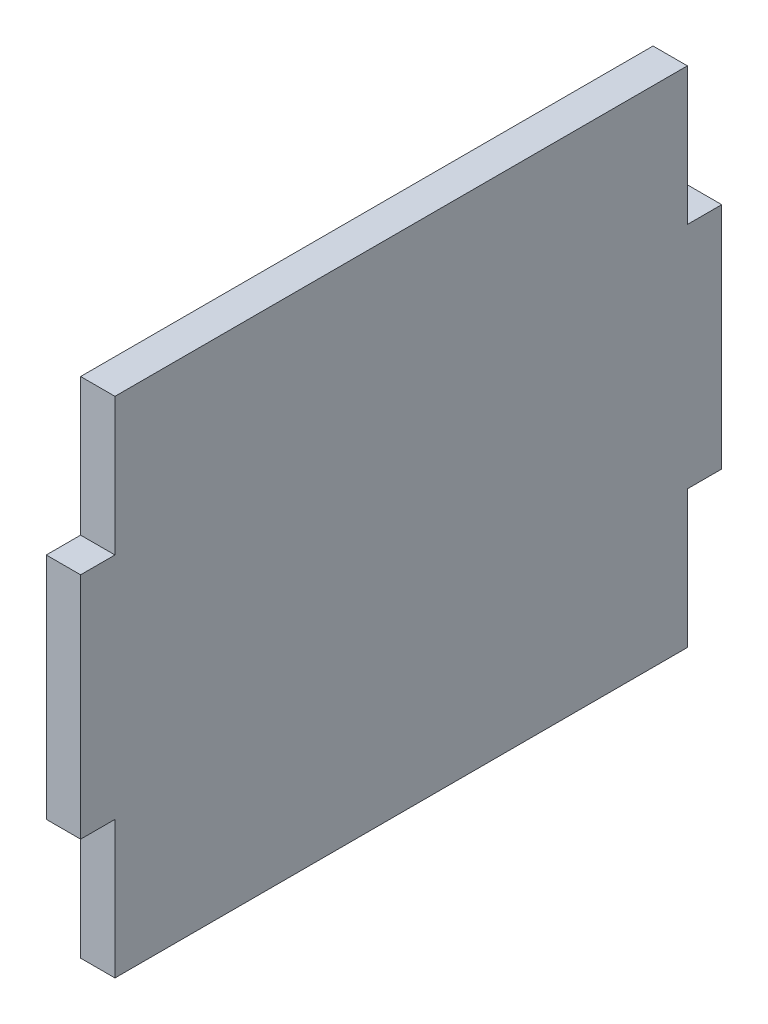
ISO-10303-21;
HEADER;
FILE_DESCRIPTION(('STEP AP214'),'2;1');
FILE_NAME('part.step','',(''),(''),'','','');
FILE_SCHEMA(('AUTOMOTIVE_DESIGN { 1 0 10303 214 1 1 1 1 }'));
ENDSEC;
DATA;
#1=APPLICATION_CONTEXT('core data for automotive mechanical design processes');
#2=APPLICATION_PROTOCOL_DEFINITION('international standard','automotive_design',2000,#1);
#3=PRODUCT_CONTEXT('',#1,'mechanical');
#4=PRODUCT('Part','Part','',(#3));
#5=PRODUCT_RELATED_PRODUCT_CATEGORY('part','',(#4));
#6=PRODUCT_DEFINITION_FORMATION('','',#4);
#7=PRODUCT_DEFINITION_CONTEXT('part definition',#1,'design');
#8=PRODUCT_DEFINITION('design','',#6,#7);
#9=PRODUCT_DEFINITION_SHAPE('','',#8);
#10=(LENGTH_UNIT() NAMED_UNIT(*) SI_UNIT(.MILLI.,.METRE.));
#11=(NAMED_UNIT(*) PLANE_ANGLE_UNIT() SI_UNIT($,.RADIAN.));
#12=(NAMED_UNIT(*) SI_UNIT($,.STERADIAN.) SOLID_ANGLE_UNIT());
#13=UNCERTAINTY_MEASURE_WITH_UNIT(LENGTH_MEASURE(1.E-05),#10,'distance_accuracy_value','');
#14=(GEOMETRIC_REPRESENTATION_CONTEXT(3) GLOBAL_UNCERTAINTY_ASSIGNED_CONTEXT((#13)) GLOBAL_UNIT_ASSIGNED_CONTEXT((#10,
#11,#12)) REPRESENTATION_CONTEXT('',''));
#15=CARTESIAN_POINT('',(0.,0.,0.));
#16=DIRECTION('',(0.,0.,1.));
#17=DIRECTION('',(1.,0.,0.));
#18=AXIS2_PLACEMENT_3D('',#15,#16,#17);
#19=CARTESIAN_POINT('',(3.,0.,0.));
#20=DIRECTION('',(0.,0.,-1.));
#21=DIRECTION('',(-1.,0.,0.));
#22=AXIS2_PLACEMENT_3D('',#19,#20,#21);
#23=PLANE('',#22);
#24=DIRECTION('',(0.,-1.,0.));
#25=VECTOR('',#24,1.);
#26=CARTESIAN_POINT('',(0.,0.,0.));
#27=LINE('',#26,#25);
#28=CARTESIAN_POINT('',(0.,12.,0.));
#29=VERTEX_POINT('',#28);
#30=CARTESIAN_POINT('',(0.,0.,0.));
#31=VERTEX_POINT('',#30);
#32=EDGE_CURVE('E159',#29,#31,#27,.T.);
#33=ORIENTED_EDGE('',*,*,#32,.T.);
#34=DIRECTION('',(-1.,0.,0.));
#35=VECTOR('',#34,1.);
#36=CARTESIAN_POINT('',(3.,0.,0.));
#37=LINE('',#36,#35);
#38=CARTESIAN_POINT('',(3.,0.,0.));
#39=VERTEX_POINT('',#38);
#40=EDGE_CURVE('E11',#39,#31,#37,.T.);
#41=ORIENTED_EDGE('',*,*,#40,.F.);
#42=DIRECTION('',(0.,-1.,0.));
#43=VECTOR('',#42,1.);
#44=CARTESIAN_POINT('',(3.,0.,0.));
#45=LINE('',#44,#43);
#46=CARTESIAN_POINT('',(3.,12.,0.));
#47=VERTEX_POINT('',#46);
#48=EDGE_CURVE('E181',#47,#39,#45,.T.);
#49=ORIENTED_EDGE('',*,*,#48,.F.);
#50=DIRECTION('',(-1.,0.,0.));
#51=VECTOR('',#50,1.);
#52=CARTESIAN_POINT('',(3.,12.,0.));
#53=LINE('',#52,#51);
#54=EDGE_CURVE('E155',#47,#29,#53,.T.);
#55=ORIENTED_EDGE('',*,*,#54,.T.);
#56=EDGE_LOOP('',(#33,#41,#49,#55));
#57=FACE_BOUND('',#56,.T.);
#58=ADVANCED_FACE('F39',(#57),#23,.F.);
#59=CARTESIAN_POINT('',(3.,0.,0.));
#60=DIRECTION('',(0.,1.,0.));
#61=DIRECTION('',(0.,0.,1.));
#62=AXIS2_PLACEMENT_3D('',#59,#60,#61);
#63=PLANE('',#62);
#64=DIRECTION('',(0.,0.,-1.));
#65=VECTOR('',#64,1.);
#66=CARTESIAN_POINT('',(0.,0.,0.));
#67=LINE('',#66,#65);
#68=CARTESIAN_POINT('',(0.,0.,-50.));
#69=VERTEX_POINT('',#68);
#70=EDGE_CURVE('E162',#31,#69,#67,.T.);
#71=ORIENTED_EDGE('',*,*,#70,.T.);
#72=DIRECTION('',(-1.,0.,0.));
#73=VECTOR('',#72,1.);
#74=CARTESIAN_POINT('',(3.,0.,-50.));
#75=LINE('',#74,#73);
#76=CARTESIAN_POINT('',(3.,0.,-50.));
#77=VERTEX_POINT('',#76);
#78=EDGE_CURVE('E47',#77,#69,#75,.T.);
#79=ORIENTED_EDGE('',*,*,#78,.F.);
#80=DIRECTION('',(0.,0.,-1.));
#81=VECTOR('',#80,1.);
#82=CARTESIAN_POINT('',(3.,0.,0.));
#83=LINE('',#82,#81);
#84=EDGE_CURVE('E110',#39,#77,#83,.T.);
#85=ORIENTED_EDGE('',*,*,#84,.F.);
#86=ORIENTED_EDGE('',*,*,#40,.T.);
#87=EDGE_LOOP('',(#71,#79,#85,#86));
#88=FACE_BOUND('',#87,.T.);
#89=ADVANCED_FACE('F259',(#88),#63,.F.);
#90=CARTESIAN_POINT('',(3.,0.,-50.));
#91=DIRECTION('',(0.,0.,1.));
#92=DIRECTION('',(1.,0.,0.));
#93=AXIS2_PLACEMENT_3D('',#90,#91,#92);
#94=PLANE('',#93);
#95=DIRECTION('',(0.,1.,0.));
#96=VECTOR('',#95,1.);
#97=CARTESIAN_POINT('',(0.,0.,-50.));
#98=LINE('',#97,#96);
#99=CARTESIAN_POINT('',(0.,12.,-50.));
#100=VERTEX_POINT('',#99);
#101=EDGE_CURVE('E164',#69,#100,#98,.T.);
#102=ORIENTED_EDGE('',*,*,#101,.T.);
#103=DIRECTION('',(-1.,0.,0.));
#104=VECTOR('',#103,1.);
#105=CARTESIAN_POINT('',(3.,12.,-50.));
#106=LINE('',#105,#104);
#107=CARTESIAN_POINT('',(3.,12.,-50.));
#108=VERTEX_POINT('',#107);
#109=EDGE_CURVE('E200',#108,#100,#106,.T.);
#110=ORIENTED_EDGE('',*,*,#109,.F.);
#111=DIRECTION('',(0.,1.,0.));
#112=VECTOR('',#111,1.);
#113=CARTESIAN_POINT('',(3.,0.,-50.));
#114=LINE('',#113,#112);
#115=EDGE_CURVE('E208',#77,#108,#114,.T.);
#116=ORIENTED_EDGE('',*,*,#115,.F.);
#117=ORIENTED_EDGE('',*,*,#78,.T.);
#118=EDGE_LOOP('',(#102,#110,#116,#117));
#119=FACE_BOUND('',#118,.T.);
#120=ADVANCED_FACE('F206',(#119),#94,.F.);
#121=CARTESIAN_POINT('',(3.,12.,-53.));
#122=DIRECTION('',(0.,1.,0.));
#123=DIRECTION('',(0.,0.,1.));
#124=AXIS2_PLACEMENT_3D('',#121,#122,#123);
#125=PLANE('',#124);
#126=DIRECTION('',(0.,0.,-1.));
#127=VECTOR('',#126,1.);
#128=CARTESIAN_POINT('',(0.,12.,-53.));
#129=LINE('',#128,#127);
#130=CARTESIAN_POINT('',(0.,12.,-53.));
#131=VERTEX_POINT('',#130);
#132=EDGE_CURVE('E166',#100,#131,#129,.T.);
#133=ORIENTED_EDGE('',*,*,#132,.T.);
#134=DIRECTION('',(-1.,0.,0.));
#135=VECTOR('',#134,1.);
#136=CARTESIAN_POINT('',(3.,12.,-53.));
#137=LINE('',#136,#135);
#138=CARTESIAN_POINT('',(3.,12.,-53.));
#139=VERTEX_POINT('',#138);
#140=EDGE_CURVE('E197',#139,#131,#137,.T.);
#141=ORIENTED_EDGE('',*,*,#140,.F.);
#142=DIRECTION('',(0.,0.,-1.));
#143=VECTOR('',#142,1.);
#144=CARTESIAN_POINT('',(3.,12.,-53.));
#145=LINE('',#144,#143);
#146=EDGE_CURVE('E226',#108,#139,#145,.T.);
#147=ORIENTED_EDGE('',*,*,#146,.F.);
#148=ORIENTED_EDGE('',*,*,#109,.T.);
#149=EDGE_LOOP('',(#133,#141,#147,#148));
#150=FACE_BOUND('',#149,.T.);
#151=ADVANCED_FACE('F217',(#150),#125,.F.);
#152=CARTESIAN_POINT('',(3.,12.,-53.));
#153=DIRECTION('',(0.,0.,1.));
#154=DIRECTION('',(1.,0.,0.));
#155=AXIS2_PLACEMENT_3D('',#152,#153,#154);
#156=PLANE('',#155);
#157=DIRECTION('',(0.,1.,0.));
#158=VECTOR('',#157,1.);
#159=CARTESIAN_POINT('',(0.,12.,-53.));
#160=LINE('',#159,#158);
#161=CARTESIAN_POINT('',(0.,32.,-53.));
#162=VERTEX_POINT('',#161);
#163=EDGE_CURVE('E168',#131,#162,#160,.T.);
#164=ORIENTED_EDGE('',*,*,#163,.T.);
#165=DIRECTION('',(-1.,0.,0.));
#166=VECTOR('',#165,1.);
#167=CARTESIAN_POINT('',(3.,32.,-53.));
#168=LINE('',#167,#166);
#169=CARTESIAN_POINT('',(3.,32.,-53.));
#170=VERTEX_POINT('',#169);
#171=EDGE_CURVE('E194',#170,#162,#168,.T.);
#172=ORIENTED_EDGE('',*,*,#171,.F.);
#173=DIRECTION('',(0.,1.,0.));
#174=VECTOR('',#173,1.);
#175=CARTESIAN_POINT('',(3.,12.,-53.));
#176=LINE('',#175,#174);
#177=EDGE_CURVE('E223',#139,#170,#176,.T.);
#178=ORIENTED_EDGE('',*,*,#177,.F.);
#179=ORIENTED_EDGE('',*,*,#140,.T.);
#180=EDGE_LOOP('',(#164,#172,#178,#179));
#181=FACE_BOUND('',#180,.T.);
#182=ADVANCED_FACE('F221',(#181),#156,.F.);
#183=CARTESIAN_POINT('',(3.,32.,-53.));
#184=DIRECTION('',(0.,-1.,0.));
#185=DIRECTION('',(0.,0.,-1.));
#186=AXIS2_PLACEMENT_3D('',#183,#184,#185);
#187=PLANE('',#186);
#188=DIRECTION('',(0.,0.,1.));
#189=VECTOR('',#188,1.);
#190=CARTESIAN_POINT('',(0.,32.,-53.));
#191=LINE('',#190,#189);
#192=CARTESIAN_POINT('',(0.,32.,-50.));
#193=VERTEX_POINT('',#192);
#194=EDGE_CURVE('E170',#162,#193,#191,.T.);
#195=ORIENTED_EDGE('',*,*,#194,.T.);
#196=DIRECTION('',(-1.,0.,0.));
#197=VECTOR('',#196,1.);
#198=CARTESIAN_POINT('',(3.,32.,-50.));
#199=LINE('',#198,#197);
#200=CARTESIAN_POINT('',(3.,32.,-50.));
#201=VERTEX_POINT('',#200);
#202=EDGE_CURVE('E191',#201,#193,#199,.T.);
#203=ORIENTED_EDGE('',*,*,#202,.F.);
#204=DIRECTION('',(0.,0.,1.));
#205=VECTOR('',#204,1.);
#206=CARTESIAN_POINT('',(3.,32.,-53.));
#207=LINE('',#206,#205);
#208=EDGE_CURVE('E225',#170,#201,#207,.T.);
#209=ORIENTED_EDGE('',*,*,#208,.F.);
#210=ORIENTED_EDGE('',*,*,#171,.T.);
#211=EDGE_LOOP('',(#195,#203,#209,#210));
#212=FACE_BOUND('',#211,.T.);
#213=ADVANCED_FACE('F272',(#212),#187,.F.);
#214=CARTESIAN_POINT('',(3.,32.,-50.));
#215=DIRECTION('',(0.,0.,1.));
#216=DIRECTION('',(1.,0.,0.));
#217=AXIS2_PLACEMENT_3D('',#214,#215,#216);
#218=PLANE('',#217);
#219=DIRECTION('',(0.,1.,0.));
#220=VECTOR('',#219,1.);
#221=CARTESIAN_POINT('',(0.,32.,-50.));
#222=LINE('',#221,#220);
#223=CARTESIAN_POINT('',(0.,44.,-50.));
#224=VERTEX_POINT('',#223);
#225=EDGE_CURVE('E172',#193,#224,#222,.T.);
#226=ORIENTED_EDGE('',*,*,#225,.T.);
#227=DIRECTION('',(-1.,0.,0.));
#228=VECTOR('',#227,1.);
#229=CARTESIAN_POINT('',(3.,44.,-50.));
#230=LINE('',#229,#228);
#231=CARTESIAN_POINT('',(3.,44.,-50.));
#232=VERTEX_POINT('',#231);
#233=EDGE_CURVE('E188',#232,#224,#230,.T.);
#234=ORIENTED_EDGE('',*,*,#233,.F.);
#235=DIRECTION('',(0.,1.,0.));
#236=VECTOR('',#235,1.);
#237=CARTESIAN_POINT('',(3.,32.,-50.));
#238=LINE('',#237,#236);
#239=EDGE_CURVE('E228',#201,#232,#238,.T.);
#240=ORIENTED_EDGE('',*,*,#239,.F.);
#241=ORIENTED_EDGE('',*,*,#202,.T.);
#242=EDGE_LOOP('',(#226,#234,#240,#241));
#243=FACE_BOUND('',#242,.T.);
#244=ADVANCED_FACE('F275',(#243),#218,.F.);
#245=CARTESIAN_POINT('',(3.,44.,0.));
#246=DIRECTION('',(0.,-1.,0.));
#247=DIRECTION('',(0.,0.,-1.));
#248=AXIS2_PLACEMENT_3D('',#245,#246,#247);
#249=PLANE('',#248);
#250=DIRECTION('',(0.,0.,1.));
#251=VECTOR('',#250,1.);
#252=CARTESIAN_POINT('',(0.,44.,0.));
#253=LINE('',#252,#251);
#254=CARTESIAN_POINT('',(0.,44.,0.));
#255=VERTEX_POINT('',#254);
#256=EDGE_CURVE('E174',#224,#255,#253,.T.);
#257=ORIENTED_EDGE('',*,*,#256,.T.);
#258=DIRECTION('',(-1.,0.,0.));
#259=VECTOR('',#258,1.);
#260=CARTESIAN_POINT('',(3.,44.,0.));
#261=LINE('',#260,#259);
#262=CARTESIAN_POINT('',(3.,44.,0.));
#263=VERTEX_POINT('',#262);
#264=EDGE_CURVE('E185',#263,#255,#261,.T.);
#265=ORIENTED_EDGE('',*,*,#264,.F.);
#266=DIRECTION('',(0.,0.,1.));
#267=VECTOR('',#266,1.);
#268=CARTESIAN_POINT('',(3.,44.,0.));
#269=LINE('',#268,#267);
#270=EDGE_CURVE('E234',#232,#263,#269,.T.);
#271=ORIENTED_EDGE('',*,*,#270,.F.);
#272=ORIENTED_EDGE('',*,*,#233,.T.);
#273=EDGE_LOOP('',(#257,#265,#271,#272));
#274=FACE_BOUND('',#273,.T.);
#275=ADVANCED_FACE('F240',(#274),#249,.F.);
#276=CARTESIAN_POINT('',(3.,32.,0.));
#277=DIRECTION('',(0.,0.,-1.));
#278=DIRECTION('',(-1.,0.,0.));
#279=AXIS2_PLACEMENT_3D('',#276,#277,#278);
#280=PLANE('',#279);
#281=DIRECTION('',(0.,-1.,0.));
#282=VECTOR('',#281,1.);
#283=CARTESIAN_POINT('',(0.,32.,0.));
#284=LINE('',#283,#282);
#285=CARTESIAN_POINT('',(0.,32.,0.));
#286=VERTEX_POINT('',#285);
#287=EDGE_CURVE('E176',#255,#286,#284,.T.);
#288=ORIENTED_EDGE('',*,*,#287,.T.);
#289=DIRECTION('',(-1.,0.,0.));
#290=VECTOR('',#289,1.);
#291=CARTESIAN_POINT('',(3.,32.,0.));
#292=LINE('',#291,#290);
#293=CARTESIAN_POINT('',(3.,32.,0.));
#294=VERTEX_POINT('',#293);
#295=EDGE_CURVE('E150',#294,#286,#292,.T.);
#296=ORIENTED_EDGE('',*,*,#295,.F.);
#297=DIRECTION('',(0.,-1.,0.));
#298=VECTOR('',#297,1.);
#299=CARTESIAN_POINT('',(3.,32.,0.));
#300=LINE('',#299,#298);
#301=EDGE_CURVE('E141',#263,#294,#300,.T.);
#302=ORIENTED_EDGE('',*,*,#301,.F.);
#303=ORIENTED_EDGE('',*,*,#264,.T.);
#304=EDGE_LOOP('',(#288,#296,#302,#303));
#305=FACE_BOUND('',#304,.T.);
#306=ADVANCED_FACE('F244',(#305),#280,.F.);
#307=CARTESIAN_POINT('',(3.,32.,3.));
#308=DIRECTION('',(0.,-1.,0.));
#309=DIRECTION('',(0.,0.,-1.));
#310=AXIS2_PLACEMENT_3D('',#307,#308,#309);
#311=PLANE('',#310);
#312=DIRECTION('',(0.,0.,1.));
#313=VECTOR('',#312,1.);
#314=CARTESIAN_POINT('',(0.,32.,3.));
#315=LINE('',#314,#313);
#316=CARTESIAN_POINT('',(0.,32.,3.));
#317=VERTEX_POINT('',#316);
#318=EDGE_CURVE('E149',#286,#317,#315,.T.);
#319=ORIENTED_EDGE('',*,*,#318,.T.);
#320=DIRECTION('',(-1.,0.,0.));
#321=VECTOR('',#320,1.);
#322=CARTESIAN_POINT('',(3.,32.,3.));
#323=LINE('',#322,#321);
#324=CARTESIAN_POINT('',(3.,32.,3.));
#325=VERTEX_POINT('',#324);
#326=EDGE_CURVE('E146',#325,#317,#323,.T.);
#327=ORIENTED_EDGE('',*,*,#326,.F.);
#328=DIRECTION('',(0.,0.,1.));
#329=VECTOR('',#328,1.);
#330=CARTESIAN_POINT('',(3.,32.,3.));
#331=LINE('',#330,#329);
#332=EDGE_CURVE('E135',#294,#325,#331,.T.);
#333=ORIENTED_EDGE('',*,*,#332,.F.);
#334=ORIENTED_EDGE('',*,*,#295,.T.);
#335=EDGE_LOOP('',(#319,#327,#333,#334));
#336=FACE_BOUND('',#335,.T.);
#337=ADVANCED_FACE('F147',(#336),#311,.F.);
#338=CARTESIAN_POINT('',(3.,12.,3.));
#339=DIRECTION('',(0.,0.,-1.));
#340=DIRECTION('',(-1.,0.,0.));
#341=AXIS2_PLACEMENT_3D('',#338,#339,#340);
#342=PLANE('',#341);
#343=DIRECTION('',(0.,-1.,0.));
#344=VECTOR('',#343,1.);
#345=CARTESIAN_POINT('',(0.,12.,3.));
#346=LINE('',#345,#344);
#347=CARTESIAN_POINT('',(0.,12.,3.));
#348=VERTEX_POINT('',#347);
#349=EDGE_CURVE('E96',#317,#348,#346,.T.);
#350=ORIENTED_EDGE('',*,*,#349,.T.);
#351=DIRECTION('',(-1.,0.,0.));
#352=VECTOR('',#351,1.);
#353=CARTESIAN_POINT('',(3.,12.,3.));
#354=LINE('',#353,#352);
#355=CARTESIAN_POINT('',(3.,12.,3.));
#356=VERTEX_POINT('',#355);
#357=EDGE_CURVE('E151',#356,#348,#354,.T.);
#358=ORIENTED_EDGE('',*,*,#357,.F.);
#359=DIRECTION('',(0.,-1.,0.));
#360=VECTOR('',#359,1.);
#361=CARTESIAN_POINT('',(3.,12.,3.));
#362=LINE('',#361,#360);
#363=EDGE_CURVE('E139',#325,#356,#362,.T.);
#364=ORIENTED_EDGE('',*,*,#363,.F.);
#365=ORIENTED_EDGE('',*,*,#326,.T.);
#366=EDGE_LOOP('',(#350,#358,#364,#365));
#367=FACE_BOUND('',#366,.T.);
#368=ADVANCED_FACE('F153',(#367),#342,.F.);
#369=CARTESIAN_POINT('',(3.,12.,3.));
#370=DIRECTION('',(0.,1.,0.));
#371=DIRECTION('',(0.,0.,1.));
#372=AXIS2_PLACEMENT_3D('',#369,#370,#371);
#373=PLANE('',#372);
#374=DIRECTION('',(0.,0.,-1.));
#375=VECTOR('',#374,1.);
#376=CARTESIAN_POINT('',(0.,12.,3.));
#377=LINE('',#376,#375);
#378=EDGE_CURVE('E102',#348,#29,#377,.T.);
#379=ORIENTED_EDGE('',*,*,#378,.T.);
#380=ORIENTED_EDGE('',*,*,#54,.F.);
#381=DIRECTION('',(0.,0.,-1.));
#382=VECTOR('',#381,1.);
#383=CARTESIAN_POINT('',(3.,12.,3.));
#384=LINE('',#383,#382);
#385=EDGE_CURVE('E55',#356,#47,#384,.T.);
#386=ORIENTED_EDGE('',*,*,#385,.F.);
#387=ORIENTED_EDGE('',*,*,#357,.T.);
#388=EDGE_LOOP('',(#379,#380,#386,#387));
#389=FACE_BOUND('',#388,.T.);
#390=ADVANCED_FACE('F248',(#389),#373,.F.);
#391=CARTESIAN_POINT('',(3.,0.,0.));
#392=DIRECTION('',(-1.,0.,0.));
#393=DIRECTION('',(0.,0.,1.));
#394=AXIS2_PLACEMENT_3D('',#391,#392,#393);
#395=PLANE('',#394);
#396=ORIENTED_EDGE('',*,*,#48,.T.);
#397=ORIENTED_EDGE('',*,*,#84,.T.);
#398=ORIENTED_EDGE('',*,*,#115,.T.);
#399=ORIENTED_EDGE('',*,*,#146,.T.);
#400=ORIENTED_EDGE('',*,*,#177,.T.);
#401=ORIENTED_EDGE('',*,*,#208,.T.);
#402=ORIENTED_EDGE('',*,*,#239,.T.);
#403=ORIENTED_EDGE('',*,*,#270,.T.);
#404=ORIENTED_EDGE('',*,*,#301,.T.);
#405=ORIENTED_EDGE('',*,*,#332,.T.);
#406=ORIENTED_EDGE('',*,*,#363,.T.);
#407=ORIENTED_EDGE('',*,*,#385,.T.);
#408=EDGE_LOOP('',(#396,#397,#398,#399,#400,#401,#402,#403,#404,#405,#406,#407));
#409=FACE_BOUND('',#408,.T.);
#410=ADVANCED_FACE('F137',(#409),#395,.F.);
#411=CARTESIAN_POINT('',(0.,0.,0.));
#412=DIRECTION('',(-1.,0.,0.));
#413=DIRECTION('',(0.,0.,1.));
#414=AXIS2_PLACEMENT_3D('',#411,#412,#413);
#415=PLANE('',#414);
#416=ORIENTED_EDGE('',*,*,#32,.F.);
#417=ORIENTED_EDGE('',*,*,#378,.F.);
#418=ORIENTED_EDGE('',*,*,#349,.F.);
#419=ORIENTED_EDGE('',*,*,#318,.F.);
#420=ORIENTED_EDGE('',*,*,#287,.F.);
#421=ORIENTED_EDGE('',*,*,#256,.F.);
#422=ORIENTED_EDGE('',*,*,#225,.F.);
#423=ORIENTED_EDGE('',*,*,#194,.F.);
#424=ORIENTED_EDGE('',*,*,#163,.F.);
#425=ORIENTED_EDGE('',*,*,#132,.F.);
#426=ORIENTED_EDGE('',*,*,#101,.F.);
#427=ORIENTED_EDGE('',*,*,#70,.F.);
#428=EDGE_LOOP('',(#416,#417,#418,#419,#420,#421,#422,#423,#424,#425,#426,#427));
#429=FACE_BOUND('',#428,.T.);
#430=ADVANCED_FACE('F212',(#429),#415,.T.);
#431=CLOSED_SHELL('',(#58,#89,#120,#151,#182,#213,#244,#275,#306,#337,#368,#390,#410,#430));
#432=MANIFOLD_SOLID_BREP('B2',#431);
#433=ADVANCED_BREP_SHAPE_REPRESENTATION('',(#18,#432),#14);
#434=SHAPE_DEFINITION_REPRESENTATION(#9,#433);
ENDSEC;
END-ISO-10303-21;
